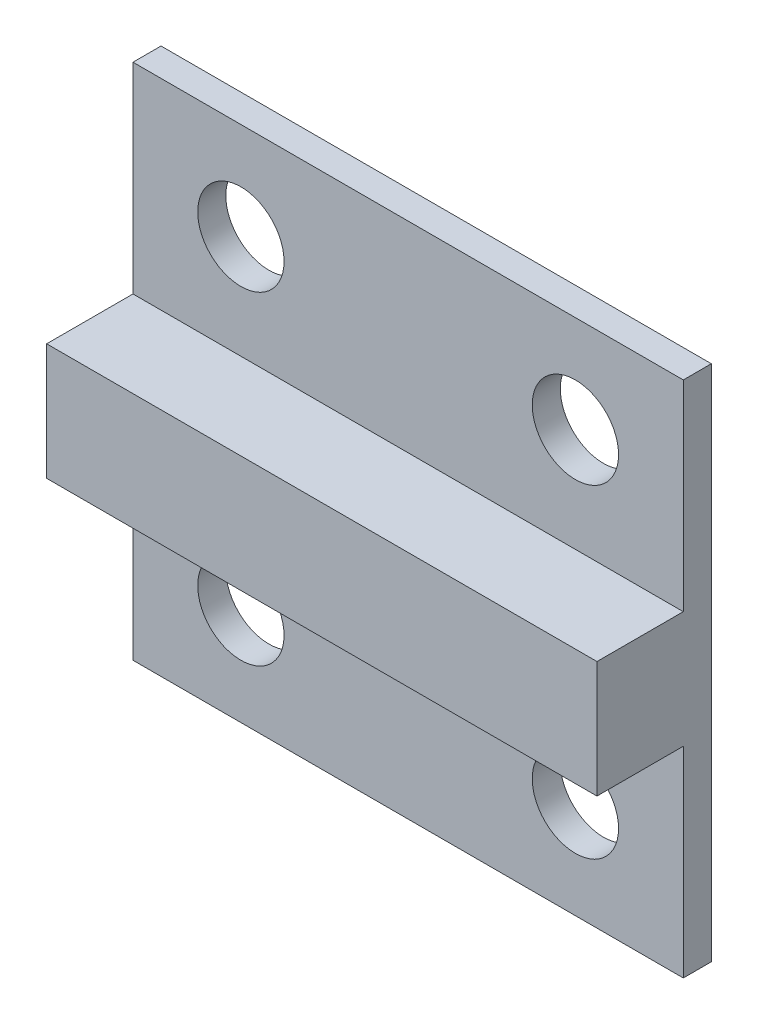
ISO-10303-21;
HEADER;
FILE_DESCRIPTION(('STEP AP214'),'2;1');
FILE_NAME('part.step','',(''),(''),'','','');
FILE_SCHEMA(('AUTOMOTIVE_DESIGN { 1 0 10303 214 1 1 1 1 }'));
ENDSEC;
DATA;
#1=APPLICATION_CONTEXT('core data for automotive mechanical design processes');
#2=APPLICATION_PROTOCOL_DEFINITION('international standard','automotive_design',2000,#1);
#3=PRODUCT_CONTEXT('',#1,'mechanical');
#4=PRODUCT('Part','Part','',(#3));
#5=PRODUCT_RELATED_PRODUCT_CATEGORY('part','',(#4));
#6=PRODUCT_DEFINITION_FORMATION('','',#4);
#7=PRODUCT_DEFINITION_CONTEXT('part definition',#1,'design');
#8=PRODUCT_DEFINITION('design','',#6,#7);
#9=PRODUCT_DEFINITION_SHAPE('','',#8);
#10=(LENGTH_UNIT() NAMED_UNIT(*) SI_UNIT(.MILLI.,.METRE.));
#11=(NAMED_UNIT(*) PLANE_ANGLE_UNIT() SI_UNIT($,.RADIAN.));
#12=(NAMED_UNIT(*) SI_UNIT($,.STERADIAN.) SOLID_ANGLE_UNIT());
#13=UNCERTAINTY_MEASURE_WITH_UNIT(LENGTH_MEASURE(1.E-05),#10,'distance_accuracy_value','');
#14=(GEOMETRIC_REPRESENTATION_CONTEXT(3) GLOBAL_UNCERTAINTY_ASSIGNED_CONTEXT((#13)) GLOBAL_UNIT_ASSIGNED_CONTEXT((#10,
#11,#12)) REPRESENTATION_CONTEXT('',''));
#15=CARTESIAN_POINT('',(0.,0.,0.));
#16=DIRECTION('',(0.,0.,1.));
#17=DIRECTION('',(1.,0.,0.));
#18=AXIS2_PLACEMENT_3D('',#15,#16,#17);
#19=CARTESIAN_POINT('',(0.,0.,1.3));
#20=DIRECTION('',(0.,0.,1.));
#21=DIRECTION('',(1.,0.,0.));
#22=AXIS2_PLACEMENT_3D('',#19,#20,#21);
#23=PLANE('',#22);
#24=CARTESIAN_POINT('',(22.327148507731,16.4922186263934,1.3));
#25=DIRECTION('',(0.,0.,1.));
#26=DIRECTION('',(1.,0.,0.));
#27=AXIS2_PLACEMENT_3D('',#24,#25,#26);
#28=CIRCLE('',#27,2.);
#29=CARTESIAN_POINT('',(24.3271485077311,16.4922186263934,1.3));
#30=VERTEX_POINT('',#29);
#31=EDGE_CURVE('E161',#30,#30,#28,.T.);
#32=ORIENTED_EDGE('',*,*,#31,.F.);
#33=EDGE_LOOP('',(#32));
#34=FACE_BOUND('',#33,.T.);
#35=CARTESIAN_POINT('',(6.82714850773105,16.4922186263934,1.3));
#36=DIRECTION('',(0.,0.,1.));
#37=DIRECTION('',(1.,0.,0.));
#38=AXIS2_PLACEMENT_3D('',#35,#36,#37);
#39=CIRCLE('',#38,2.);
#40=CARTESIAN_POINT('',(8.82714850773105,16.4922186263934,1.3));
#41=VERTEX_POINT('',#40);
#42=EDGE_CURVE('E169',#41,#41,#39,.T.);
#43=ORIENTED_EDGE('',*,*,#42,.F.);
#44=EDGE_LOOP('',(#43));
#45=FACE_BOUND('',#44,.T.);
#46=DIRECTION('',(-1.,0.,0.));
#47=VECTOR('',#46,1.);
#48=CARTESIAN_POINT('',(1.82714850773105,11.6922186263934,1.3));
#49=LINE('',#48,#47);
#50=CARTESIAN_POINT('',(27.327148507731,11.6922186263934,1.3));
#51=VERTEX_POINT('',#50);
#52=CARTESIAN_POINT('',(1.82714850773105,11.6922186263934,1.3));
#53=VERTEX_POINT('',#52);
#54=EDGE_CURVE('E54',#51,#53,#49,.T.);
#55=ORIENTED_EDGE('',*,*,#54,.F.);
#56=DIRECTION('',(0.,1.,0.));
#57=VECTOR('',#56,1.);
#58=CARTESIAN_POINT('',(27.327148507731,20.9922186263934,1.3));
#59=LINE('',#58,#57);
#60=CARTESIAN_POINT('',(27.327148507731,20.9922186263934,1.3));
#61=VERTEX_POINT('',#60);
#62=EDGE_CURVE('E139',#51,#61,#59,.T.);
#63=ORIENTED_EDGE('',*,*,#62,.T.);
#64=DIRECTION('',(-1.,0.,0.));
#65=VECTOR('',#64,1.);
#66=CARTESIAN_POINT('',(1.82714850773105,20.9922186263934,1.3));
#67=LINE('',#66,#65);
#68=CARTESIAN_POINT('',(1.82714850773105,20.9922186263934,1.3));
#69=VERTEX_POINT('',#68);
#70=EDGE_CURVE('E142',#61,#69,#67,.T.);
#71=ORIENTED_EDGE('',*,*,#70,.T.);
#72=DIRECTION('',(0.,-1.,0.));
#73=VECTOR('',#72,1.);
#74=CARTESIAN_POINT('',(1.82714850773105,20.9922186263934,1.3));
#75=LINE('',#74,#73);
#76=EDGE_CURVE('E135',#69,#53,#75,.T.);
#77=ORIENTED_EDGE('',*,*,#76,.T.);
#78=EDGE_LOOP('',(#55,#63,#71,#77));
#79=FACE_BOUND('',#78,.T.);
#80=ADVANCED_FACE('F37',(#34,#45,#79),#23,.T.);
#81=CARTESIAN_POINT('',(1.82714850773105,20.9922186263934,1.3));
#82=DIRECTION('',(1.,0.,0.));
#83=DIRECTION('',(0.,1.,0.));
#84=AXIS2_PLACEMENT_3D('',#81,#82,#83);
#85=PLANE('',#84);
#86=DIRECTION('',(0.,-1.,0.));
#87=VECTOR('',#86,1.);
#88=CARTESIAN_POINT('',(1.82714850773105,20.9922186263934,0.));
#89=LINE('',#88,#87);
#90=CARTESIAN_POINT('',(1.82714850773105,20.9922186263934,0.));
#91=VERTEX_POINT('',#90);
#92=CARTESIAN_POINT('',(1.82714850773105,-3.00778137360661,0.));
#93=VERTEX_POINT('',#92);
#94=EDGE_CURVE('E127',#91,#93,#89,.T.);
#95=ORIENTED_EDGE('',*,*,#94,.T.);
#96=DIRECTION('',(0.,0.,-1.));
#97=VECTOR('',#96,1.);
#98=CARTESIAN_POINT('',(1.82714850773105,-3.00778137360661,1.3));
#99=LINE('',#98,#97);
#100=CARTESIAN_POINT('',(1.82714850773105,-3.00778137360661,1.3));
#101=VERTEX_POINT('',#100);
#102=EDGE_CURVE('E11',#101,#93,#99,.T.);
#103=ORIENTED_EDGE('',*,*,#102,.F.);
#104=CARTESIAN_POINT('',(1.82714850773105,6.29221862639339,1.3));
#105=VERTEX_POINT('',#104);
#106=EDGE_CURVE('E126',#105,#101,#75,.T.);
#107=ORIENTED_EDGE('',*,*,#106,.F.);
#108=DIRECTION('',(0.,0.,-1.));
#109=VECTOR('',#108,1.);
#110=CARTESIAN_POINT('',(1.82714850773105,6.29221862639339,5.3));
#111=LINE('',#110,#109);
#112=CARTESIAN_POINT('',(1.82714850773105,6.29221862639339,5.3));
#113=VERTEX_POINT('',#112);
#114=EDGE_CURVE('E108',#113,#105,#111,.T.);
#115=ORIENTED_EDGE('',*,*,#114,.F.);
#116=DIRECTION('',(0.,-1.,0.));
#117=VECTOR('',#116,1.);
#118=CARTESIAN_POINT('',(1.82714850773105,11.6922186263934,5.3));
#119=LINE('',#118,#117);
#120=CARTESIAN_POINT('',(1.82714850773105,11.6922186263934,5.3));
#121=VERTEX_POINT('',#120);
#122=EDGE_CURVE('E114',#121,#113,#119,.T.);
#123=ORIENTED_EDGE('',*,*,#122,.F.);
#124=DIRECTION('',(0.,0.,-1.));
#125=VECTOR('',#124,1.);
#126=CARTESIAN_POINT('',(1.82714850773105,11.6922186263934,5.3));
#127=LINE('',#126,#125);
#128=EDGE_CURVE('E184',#121,#53,#127,.T.);
#129=ORIENTED_EDGE('',*,*,#128,.T.);
#130=ORIENTED_EDGE('',*,*,#76,.F.);
#131=DIRECTION('',(0.,0.,-1.));
#132=VECTOR('',#131,1.);
#133=CARTESIAN_POINT('',(1.82714850773105,20.9922186263934,1.3));
#134=LINE('',#133,#132);
#135=EDGE_CURVE('E143',#69,#91,#134,.T.);
#136=ORIENTED_EDGE('',*,*,#135,.T.);
#137=EDGE_LOOP('',(#95,#103,#107,#115,#123,#129,#130,#136));
#138=FACE_BOUND('',#137,.T.);
#139=ADVANCED_FACE('F39',(#138),#85,.F.);
#140=CARTESIAN_POINT('',(1.82714850773105,-3.00778137360661,1.3));
#141=DIRECTION('',(0.,1.,0.));
#142=DIRECTION('',(0.,0.,1.));
#143=AXIS2_PLACEMENT_3D('',#140,#141,#142);
#144=PLANE('',#143);
#145=DIRECTION('',(1.,0.,0.));
#146=VECTOR('',#145,1.);
#147=CARTESIAN_POINT('',(1.82714850773105,-3.00778137360661,0.));
#148=LINE('',#147,#146);
#149=CARTESIAN_POINT('',(27.3271485077311,-3.00778137360661,0.));
#150=VERTEX_POINT('',#149);
#151=EDGE_CURVE('E129',#93,#150,#148,.T.);
#152=ORIENTED_EDGE('',*,*,#151,.T.);
#153=DIRECTION('',(0.,0.,-1.));
#154=VECTOR('',#153,1.);
#155=CARTESIAN_POINT('',(27.3271485077311,-3.00778137360661,1.3));
#156=LINE('',#155,#154);
#157=CARTESIAN_POINT('',(27.3271485077311,-3.00778137360661,1.3));
#158=VERTEX_POINT('',#157);
#159=EDGE_CURVE('E46',#158,#150,#156,.T.);
#160=ORIENTED_EDGE('',*,*,#159,.F.);
#161=DIRECTION('',(1.,0.,0.));
#162=VECTOR('',#161,1.);
#163=CARTESIAN_POINT('',(1.82714850773105,-3.00778137360661,1.3));
#164=LINE('',#163,#162);
#165=EDGE_CURVE('E137',#101,#158,#164,.T.);
#166=ORIENTED_EDGE('',*,*,#165,.F.);
#167=ORIENTED_EDGE('',*,*,#102,.T.);
#168=EDGE_LOOP('',(#152,#160,#166,#167));
#169=FACE_BOUND('',#168,.T.);
#170=ADVANCED_FACE('F207',(#169),#144,.F.);
#171=CARTESIAN_POINT('',(27.327148507731,20.9922186263934,1.3));
#172=DIRECTION('',(-1.,0.,0.));
#173=DIRECTION('',(0.,-1.,0.));
#174=AXIS2_PLACEMENT_3D('',#171,#172,#173);
#175=PLANE('',#174);
#176=DIRECTION('',(0.,1.,0.));
#177=VECTOR('',#176,1.);
#178=CARTESIAN_POINT('',(27.327148507731,20.9922186263934,0.));
#179=LINE('',#178,#177);
#180=CARTESIAN_POINT('',(27.327148507731,20.9922186263934,0.));
#181=VERTEX_POINT('',#180);
#182=EDGE_CURVE('E146',#150,#181,#179,.T.);
#183=ORIENTED_EDGE('',*,*,#182,.T.);
#184=DIRECTION('',(0.,0.,-1.));
#185=VECTOR('',#184,1.);
#186=CARTESIAN_POINT('',(27.327148507731,20.9922186263934,1.3));
#187=LINE('',#186,#185);
#188=EDGE_CURVE('E152',#61,#181,#187,.T.);
#189=ORIENTED_EDGE('',*,*,#188,.F.);
#190=ORIENTED_EDGE('',*,*,#62,.F.);
#191=DIRECTION('',(0.,0.,-1.));
#192=VECTOR('',#191,1.);
#193=CARTESIAN_POINT('',(27.3271485077311,11.6922186263934,5.3));
#194=LINE('',#193,#192);
#195=CARTESIAN_POINT('',(27.3271485077311,11.6922186263934,5.3));
#196=VERTEX_POINT('',#195);
#197=EDGE_CURVE('E131',#196,#51,#194,.T.);
#198=ORIENTED_EDGE('',*,*,#197,.F.);
#199=DIRECTION('',(0.,1.,0.));
#200=VECTOR('',#199,1.);
#201=CARTESIAN_POINT('',(27.3271485077311,11.6922186263934,5.3));
#202=LINE('',#201,#200);
#203=CARTESIAN_POINT('',(27.3271485077311,6.29221862639339,5.3));
#204=VERTEX_POINT('',#203);
#205=EDGE_CURVE('E113',#204,#196,#202,.T.);
#206=ORIENTED_EDGE('',*,*,#205,.F.);
#207=DIRECTION('',(0.,0.,-1.));
#208=VECTOR('',#207,1.);
#209=CARTESIAN_POINT('',(27.3271485077311,6.29221862639339,5.3));
#210=LINE('',#209,#208);
#211=CARTESIAN_POINT('',(27.3271485077311,6.29221862639339,1.3));
#212=VERTEX_POINT('',#211);
#213=EDGE_CURVE('E110',#204,#212,#210,.T.);
#214=ORIENTED_EDGE('',*,*,#213,.T.);
#215=EDGE_CURVE('E140',#158,#212,#59,.T.);
#216=ORIENTED_EDGE('',*,*,#215,.F.);
#217=ORIENTED_EDGE('',*,*,#159,.T.);
#218=EDGE_LOOP('',(#183,#189,#190,#198,#206,#214,#216,#217));
#219=FACE_BOUND('',#218,.T.);
#220=ADVANCED_FACE('F192',(#219),#175,.F.);
#221=CARTESIAN_POINT('',(1.82714850773105,20.9922186263934,1.3));
#222=DIRECTION('',(0.,-1.,0.));
#223=DIRECTION('',(0.,0.,-1.));
#224=AXIS2_PLACEMENT_3D('',#221,#222,#223);
#225=PLANE('',#224);
#226=DIRECTION('',(-1.,0.,0.));
#227=VECTOR('',#226,1.);
#228=CARTESIAN_POINT('',(1.82714850773105,20.9922186263934,0.));
#229=LINE('',#228,#227);
#230=EDGE_CURVE('E148',#181,#91,#229,.T.);
#231=ORIENTED_EDGE('',*,*,#230,.T.);
#232=ORIENTED_EDGE('',*,*,#135,.F.);
#233=ORIENTED_EDGE('',*,*,#70,.F.);
#234=ORIENTED_EDGE('',*,*,#188,.T.);
#235=EDGE_LOOP('',(#231,#232,#233,#234));
#236=FACE_BOUND('',#235,.T.);
#237=ADVANCED_FACE('F198',(#236),#225,.F.);
#238=CARTESIAN_POINT('',(6.82714850773105,1.49221862639339,1.3));
#239=DIRECTION('',(0.,0.,1.));
#240=DIRECTION('',(1.,0.,0.));
#241=AXIS2_PLACEMENT_3D('',#238,#239,#240);
#242=CIRCLE('',#241,2.);
#243=CARTESIAN_POINT('',(8.82714850773105,1.49221862639339,1.3));
#244=VERTEX_POINT('',#243);
#245=EDGE_CURVE('E165',#244,#244,#242,.T.);
#246=ORIENTED_EDGE('',*,*,#245,.F.);
#247=EDGE_LOOP('',(#246));
#248=FACE_BOUND('',#247,.T.);
#249=CARTESIAN_POINT('',(22.3271485077311,1.49221862639339,1.3));
#250=DIRECTION('',(0.,0.,1.));
#251=DIRECTION('',(1.,0.,0.));
#252=AXIS2_PLACEMENT_3D('',#249,#250,#251);
#253=CIRCLE('',#252,2.);
#254=CARTESIAN_POINT('',(24.3271485077311,1.49221862639339,1.3));
#255=VERTEX_POINT('',#254);
#256=EDGE_CURVE('E171',#255,#255,#253,.T.);
#257=ORIENTED_EDGE('',*,*,#256,.F.);
#258=EDGE_LOOP('',(#257));
#259=FACE_BOUND('',#258,.T.);
#260=DIRECTION('',(1.,0.,0.));
#261=VECTOR('',#260,1.);
#262=CARTESIAN_POINT('',(1.82714850773105,6.29221862639339,1.3));
#263=LINE('',#262,#261);
#264=EDGE_CURVE('E62',#105,#212,#263,.T.);
#265=ORIENTED_EDGE('',*,*,#264,.F.);
#266=ORIENTED_EDGE('',*,*,#106,.T.);
#267=ORIENTED_EDGE('',*,*,#165,.T.);
#268=ORIENTED_EDGE('',*,*,#215,.T.);
#269=EDGE_LOOP('',(#265,#266,#267,#268));
#270=FACE_BOUND('',#269,.T.);
#271=ADVANCED_FACE('F209',(#248,#259,#270),#23,.T.);
#272=CARTESIAN_POINT('',(0.,0.,0.));
#273=DIRECTION('',(0.,0.,1.));
#274=DIRECTION('',(1.,0.,0.));
#275=AXIS2_PLACEMENT_3D('',#272,#273,#274);
#276=PLANE('',#275);
#277=CARTESIAN_POINT('',(6.82714850773105,1.49221862639339,0.));
#278=DIRECTION('',(0.,0.,1.));
#279=DIRECTION('',(1.,0.,0.));
#280=AXIS2_PLACEMENT_3D('',#277,#278,#279);
#281=CIRCLE('',#280,2.);
#282=CARTESIAN_POINT('',(8.82714850773105,1.49221862639339,0.));
#283=VERTEX_POINT('',#282);
#284=EDGE_CURVE('E41',#283,#283,#281,.T.);
#285=ORIENTED_EDGE('',*,*,#284,.T.);
#286=EDGE_LOOP('',(#285));
#287=FACE_BOUND('',#286,.T.);
#288=CARTESIAN_POINT('',(22.3271485077311,1.49221862639339,0.));
#289=DIRECTION('',(0.,0.,1.));
#290=DIRECTION('',(1.,0.,0.));
#291=AXIS2_PLACEMENT_3D('',#288,#289,#290);
#292=CIRCLE('',#291,2.);
#293=CARTESIAN_POINT('',(24.3271485077311,1.49221862639339,0.));
#294=VERTEX_POINT('',#293);
#295=EDGE_CURVE('E163',#294,#294,#292,.T.);
#296=ORIENTED_EDGE('',*,*,#295,.T.);
#297=EDGE_LOOP('',(#296));
#298=FACE_BOUND('',#297,.T.);
#299=CARTESIAN_POINT('',(22.327148507731,16.4922186263934,0.));
#300=DIRECTION('',(0.,0.,1.));
#301=DIRECTION('',(1.,0.,0.));
#302=AXIS2_PLACEMENT_3D('',#299,#300,#301);
#303=CIRCLE('',#302,2.);
#304=CARTESIAN_POINT('',(24.3271485077311,16.4922186263934,0.));
#305=VERTEX_POINT('',#304);
#306=EDGE_CURVE('E160',#305,#305,#303,.T.);
#307=ORIENTED_EDGE('',*,*,#306,.T.);
#308=EDGE_LOOP('',(#307));
#309=FACE_BOUND('',#308,.T.);
#310=CARTESIAN_POINT('',(6.82714850773105,16.4922186263934,0.));
#311=DIRECTION('',(0.,0.,1.));
#312=DIRECTION('',(1.,0.,0.));
#313=AXIS2_PLACEMENT_3D('',#310,#311,#312);
#314=CIRCLE('',#313,2.);
#315=CARTESIAN_POINT('',(8.82714850773105,16.4922186263934,0.));
#316=VERTEX_POINT('',#315);
#317=EDGE_CURVE('E157',#316,#316,#314,.T.);
#318=ORIENTED_EDGE('',*,*,#317,.T.);
#319=EDGE_LOOP('',(#318));
#320=FACE_BOUND('',#319,.T.);
#321=ORIENTED_EDGE('',*,*,#94,.F.);
#322=ORIENTED_EDGE('',*,*,#230,.F.);
#323=ORIENTED_EDGE('',*,*,#182,.F.);
#324=ORIENTED_EDGE('',*,*,#151,.F.);
#325=EDGE_LOOP('',(#321,#322,#323,#324));
#326=FACE_BOUND('',#325,.T.);
#327=ADVANCED_FACE('F202',(#287,#298,#309,#320,#326),#276,.F.);
#328=CARTESIAN_POINT('',(1.82714850773105,6.29221862639339,5.3));
#329=DIRECTION('',(0.,1.,0.));
#330=DIRECTION('',(0.,0.,1.));
#331=AXIS2_PLACEMENT_3D('',#328,#329,#330);
#332=PLANE('',#331);
#333=ORIENTED_EDGE('',*,*,#264,.T.);
#334=ORIENTED_EDGE('',*,*,#213,.F.);
#335=DIRECTION('',(1.,0.,0.));
#336=VECTOR('',#335,1.);
#337=CARTESIAN_POINT('',(1.82714850773105,6.29221862639339,5.3));
#338=LINE('',#337,#336);
#339=EDGE_CURVE('E104',#113,#204,#338,.T.);
#340=ORIENTED_EDGE('',*,*,#339,.F.);
#341=ORIENTED_EDGE('',*,*,#114,.T.);
#342=EDGE_LOOP('',(#333,#334,#340,#341));
#343=FACE_BOUND('',#342,.T.);
#344=ADVANCED_FACE('F106',(#343),#332,.F.);
#345=CARTESIAN_POINT('',(1.82714850773105,11.6922186263934,5.3));
#346=DIRECTION('',(0.,-1.,0.));
#347=DIRECTION('',(0.,0.,-1.));
#348=AXIS2_PLACEMENT_3D('',#345,#346,#347);
#349=PLANE('',#348);
#350=ORIENTED_EDGE('',*,*,#54,.T.);
#351=ORIENTED_EDGE('',*,*,#128,.F.);
#352=DIRECTION('',(-1.,0.,0.));
#353=VECTOR('',#352,1.);
#354=CARTESIAN_POINT('',(1.82714850773105,11.6922186263934,5.3));
#355=LINE('',#354,#353);
#356=EDGE_CURVE('E119',#196,#121,#355,.T.);
#357=ORIENTED_EDGE('',*,*,#356,.F.);
#358=ORIENTED_EDGE('',*,*,#197,.T.);
#359=EDGE_LOOP('',(#350,#351,#357,#358));
#360=FACE_BOUND('',#359,.T.);
#361=ADVANCED_FACE('F190',(#360),#349,.F.);
#362=CARTESIAN_POINT('',(0.,0.,5.3));
#363=DIRECTION('',(0.,0.,1.));
#364=DIRECTION('',(1.,0.,0.));
#365=AXIS2_PLACEMENT_3D('',#362,#363,#364);
#366=PLANE('',#365);
#367=ORIENTED_EDGE('',*,*,#122,.T.);
#368=ORIENTED_EDGE('',*,*,#339,.T.);
#369=ORIENTED_EDGE('',*,*,#205,.T.);
#370=ORIENTED_EDGE('',*,*,#356,.T.);
#371=EDGE_LOOP('',(#367,#368,#369,#370));
#372=FACE_BOUND('',#371,.T.);
#373=ADVANCED_FACE('F117',(#372),#366,.T.);
#374=CARTESIAN_POINT('',(6.82714850773105,16.4922186263934,-2.7));
#375=DIRECTION('',(0.,0.,1.));
#376=DIRECTION('',(1.,0.,0.));
#377=AXIS2_PLACEMENT_3D('',#374,#375,#376);
#378=CYLINDRICAL_SURFACE('',#377,2.);
#379=ORIENTED_EDGE('',*,*,#42,.T.);
#380=EDGE_LOOP('',(#379));
#381=FACE_BOUND('',#380,.T.);
#382=ORIENTED_EDGE('',*,*,#317,.F.);
#383=EDGE_LOOP('',(#382));
#384=FACE_BOUND('',#383,.T.);
#385=ADVANCED_FACE('F231',(#381,#384),#378,.F.);
#386=CARTESIAN_POINT('',(22.327148507731,16.4922186263934,-2.7));
#387=DIRECTION('',(0.,0.,1.));
#388=DIRECTION('',(1.,0.,0.));
#389=AXIS2_PLACEMENT_3D('',#386,#387,#388);
#390=CYLINDRICAL_SURFACE('',#389,2.);
#391=ORIENTED_EDGE('',*,*,#31,.T.);
#392=EDGE_LOOP('',(#391));
#393=FACE_BOUND('',#392,.T.);
#394=ORIENTED_EDGE('',*,*,#306,.F.);
#395=EDGE_LOOP('',(#394));
#396=FACE_BOUND('',#395,.T.);
#397=ADVANCED_FACE('F234',(#393,#396),#390,.F.);
#398=CARTESIAN_POINT('',(22.3271485077311,1.49221862639339,-2.7));
#399=DIRECTION('',(0.,0.,1.));
#400=DIRECTION('',(1.,0.,0.));
#401=AXIS2_PLACEMENT_3D('',#398,#399,#400);
#402=CYLINDRICAL_SURFACE('',#401,2.);
#403=ORIENTED_EDGE('',*,*,#256,.T.);
#404=EDGE_LOOP('',(#403));
#405=FACE_BOUND('',#404,.T.);
#406=ORIENTED_EDGE('',*,*,#295,.F.);
#407=EDGE_LOOP('',(#406));
#408=FACE_BOUND('',#407,.T.);
#409=ADVANCED_FACE('F242',(#405,#408),#402,.F.);
#410=CARTESIAN_POINT('',(6.82714850773105,1.49221862639339,-2.7));
#411=DIRECTION('',(0.,0.,1.));
#412=DIRECTION('',(1.,0.,0.));
#413=AXIS2_PLACEMENT_3D('',#410,#411,#412);
#414=CYLINDRICAL_SURFACE('',#413,2.);
#415=ORIENTED_EDGE('',*,*,#245,.T.);
#416=EDGE_LOOP('',(#415));
#417=FACE_BOUND('',#416,.T.);
#418=ORIENTED_EDGE('',*,*,#284,.F.);
#419=EDGE_LOOP('',(#418));
#420=FACE_BOUND('',#419,.T.);
#421=ADVANCED_FACE('F296',(#417,#420),#414,.F.);
#422=CLOSED_SHELL('',(#80,#139,#170,#220,#237,#271,#327,#344,#361,#373,#385,#397,#409,#421));
#423=MANIFOLD_SOLID_BREP('B2',#422);
#424=ADVANCED_BREP_SHAPE_REPRESENTATION('',(#18,#423),#14);
#425=SHAPE_DEFINITION_REPRESENTATION(#9,#424);
ENDSEC;
END-ISO-10303-21;
